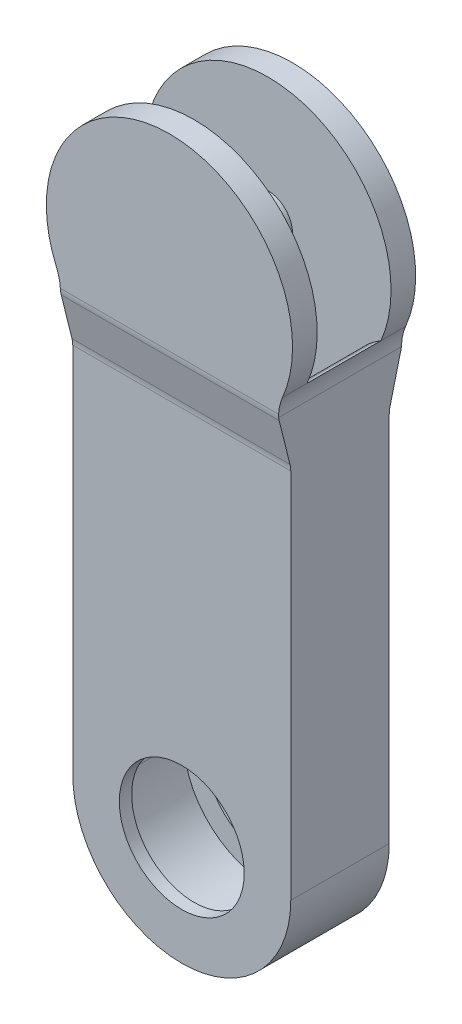
ISO-10303-21;
HEADER;
FILE_DESCRIPTION(('STEP AP214'),'2;1');
FILE_NAME('part.step','',(''),(''),'','','');
FILE_SCHEMA(('AUTOMOTIVE_DESIGN { 1 0 10303 214 1 1 1 1 }'));
ENDSEC;
DATA;
#1=APPLICATION_CONTEXT('core data for automotive mechanical design processes');
#2=APPLICATION_PROTOCOL_DEFINITION('international standard','automotive_design',2000,#1);
#3=PRODUCT_CONTEXT('',#1,'mechanical');
#4=PRODUCT('Part','Part','',(#3));
#5=PRODUCT_RELATED_PRODUCT_CATEGORY('part','',(#4));
#6=PRODUCT_DEFINITION_FORMATION('','',#4);
#7=PRODUCT_DEFINITION_CONTEXT('part definition',#1,'design');
#8=PRODUCT_DEFINITION('design','',#6,#7);
#9=PRODUCT_DEFINITION_SHAPE('','',#8);
#10=(LENGTH_UNIT() NAMED_UNIT(*) SI_UNIT(.MILLI.,.METRE.));
#11=(NAMED_UNIT(*) PLANE_ANGLE_UNIT() SI_UNIT($,.RADIAN.));
#12=(NAMED_UNIT(*) SI_UNIT($,.STERADIAN.) SOLID_ANGLE_UNIT());
#13=UNCERTAINTY_MEASURE_WITH_UNIT(LENGTH_MEASURE(1.E-05),#10,'distance_accuracy_value','');
#14=(GEOMETRIC_REPRESENTATION_CONTEXT(3) GLOBAL_UNCERTAINTY_ASSIGNED_CONTEXT((#13)) GLOBAL_UNIT_ASSIGNED_CONTEXT((#10,
#11,#12)) REPRESENTATION_CONTEXT('',''));
#15=CARTESIAN_POINT('',(0.,0.,0.));
#16=DIRECTION('',(0.,0.,1.));
#17=DIRECTION('',(1.,0.,0.));
#18=AXIS2_PLACEMENT_3D('',#15,#16,#17);
#19=CARTESIAN_POINT('',(0.,0.,25.));
#20=DIRECTION('',(0.,0.,-1.));
#21=DIRECTION('',(-1.,0.,0.));
#22=AXIS2_PLACEMENT_3D('',#19,#20,#21);
#23=CYLINDRICAL_SURFACE('',#22,50.);
#24=CARTESIAN_POINT('',(0.,0.,-15.));
#25=DIRECTION('',(0.,0.,1.));
#26=DIRECTION('',(1.,0.,0.));
#27=AXIS2_PLACEMENT_3D('',#24,#25,#26);
#28=CIRCLE('',#27,50.);
#29=CARTESIAN_POINT('',(45.9093584461448,-19.8073422513823,-15.));
#30=VERTEX_POINT('',#29);
#31=CARTESIAN_POINT('',(-45.9093584461448,-19.8073422513823,-15.));
#32=VERTEX_POINT('',#31);
#33=EDGE_CURVE('E399',#30,#32,#28,.T.);
#34=ORIENTED_EDGE('',*,*,#33,.F.);
#35=DIRECTION('',(0.,0.,-1.));
#36=VECTOR('',#35,1.);
#37=CARTESIAN_POINT('',(45.9093584461448,-19.8073422513823,25.));
#38=LINE('',#37,#36);
#39=CARTESIAN_POINT('',(45.9093584461448,-19.8073422513823,-25.));
#40=VERTEX_POINT('',#39);
#41=EDGE_CURVE('E334',#30,#40,#38,.T.);
#42=ORIENTED_EDGE('',*,*,#41,.T.);
#43=CARTESIAN_POINT('',(0.,0.,-25.));
#44=DIRECTION('',(0.,0.,1.));
#45=DIRECTION('',(1.,0.,0.));
#46=AXIS2_PLACEMENT_3D('',#43,#44,#45);
#47=CIRCLE('',#46,50.);
#48=CARTESIAN_POINT('',(-45.9093584461448,-19.8073422513823,-25.));
#49=VERTEX_POINT('',#48);
#50=EDGE_CURVE('E342',#40,#49,#47,.T.);
#51=ORIENTED_EDGE('',*,*,#50,.T.);
#52=DIRECTION('',(0.,0.,-1.));
#53=VECTOR('',#52,1.);
#54=CARTESIAN_POINT('',(-45.9093584461448,-19.8073422513823,25.));
#55=LINE('',#54,#53);
#56=EDGE_CURVE('E341',#32,#49,#55,.T.);
#57=ORIENTED_EDGE('',*,*,#56,.F.);
#58=EDGE_LOOP('',(#34,#42,#51,#57));
#59=FACE_BOUND('',#58,.T.);
#60=ADVANCED_FACE('F36',(#59),#23,.T.);
#61=CARTESIAN_POINT('',(-64.2731018246027,-27.7302791519353,25.));
#62=DIRECTION('',(0.,0.,-1.));
#63=DIRECTION('',(-1.,0.,0.));
#64=AXIS2_PLACEMENT_3D('',#61,#62,#63);
#65=CYLINDRICAL_SURFACE('',#64,20.);
#66=DIRECTION('',(0.,0.,-1.));
#67=VECTOR('',#66,1.);
#68=CARTESIAN_POINT('',(-44.2731018246027,-27.7302791519353,25.));
#69=LINE('',#68,#67);
#70=CARTESIAN_POINT('',(-44.2731018246027,-27.7302791519353,24.9239357360943));
#71=VERTEX_POINT('',#70);
#72=CARTESIAN_POINT('',(-44.2731018246027,-27.7302791519353,-24.9239357360943));
#73=VERTEX_POINT('',#72);
#74=EDGE_CURVE('E213',#71,#73,#69,.T.);
#75=ORIENTED_EDGE('',*,*,#74,.F.);
#76=CARTESIAN_POINT('',(-44.2731018246027,-27.7302791519353,24.9239357360943));
#77=CARTESIAN_POINT('',(-44.2730792391154,-27.5256910084496,24.9492904389356));
#78=CARTESIAN_POINT('',(-44.2762282332329,-27.3208089153584,24.9683064790151));
#79=CARTESIAN_POINT('',(-44.2888693806775,-26.9104568299662,24.9936612336503));
#80=CARTESIAN_POINT('',(-44.2983615340046,-26.7049868376652,24.999999948206));
#81=CARTESIAN_POINT('',(-44.3110252669364,-26.4992228957587,25.));
#82=B_SPLINE_CURVE_WITH_KNOTS('',3,(#76,#77,#78,#79,#80,#81),.UNSPECIFIED.,.F.,.F.,(4,2,4),(0.,
0.617360334102563,1.23472066820134),.UNSPECIFIED.);
#83=CARTESIAN_POINT('',(-44.3110252669364,-26.4992228957587,25.));
#84=VERTEX_POINT('',#83);
#85=EDGE_CURVE('E254',#71,#84,#82,.T.);
#86=ORIENTED_EDGE('',*,*,#85,.T.);
#87=CARTESIAN_POINT('',(-64.2731018246027,-27.7302791519353,25.));
#88=DIRECTION('',(0.,0.,-1.));
#89=DIRECTION('',(1.,0.,0.));
#90=AXIS2_PLACEMENT_3D('',#87,#88,#89);
#91=CIRCLE('',#90,20.);
#92=CARTESIAN_POINT('',(-45.9093584461448,-19.8073422513823,25.));
#93=VERTEX_POINT('',#92);
#94=EDGE_CURVE('E345',#93,#84,#91,.T.);
#95=ORIENTED_EDGE('',*,*,#94,.F.);
#96=CARTESIAN_POINT('',(-45.9093584461448,-19.8073422513823,15.));
#97=VERTEX_POINT('',#96);
#98=EDGE_CURVE('E338',#93,#97,#55,.T.);
#99=ORIENTED_EDGE('',*,*,#98,.T.);
#100=DIRECTION('',(0.,0.,1.));
#101=VECTOR('',#100,1.);
#102=CARTESIAN_POINT('',(-45.9093584461448,-19.8073422513823,-15.));
#103=LINE('',#102,#101);
#104=EDGE_CURVE('E370',#32,#97,#103,.T.);
#105=ORIENTED_EDGE('',*,*,#104,.F.);
#106=ORIENTED_EDGE('',*,*,#56,.T.);
#107=CARTESIAN_POINT('',(-64.2731018246027,-27.7302791519353,-25.));
#108=DIRECTION('',(0.,0.,-1.));
#109=DIRECTION('',(1.,0.,0.));
#110=AXIS2_PLACEMENT_3D('',#107,#108,#109);
#111=CIRCLE('',#110,20.);
#112=CARTESIAN_POINT('',(-44.3110252669364,-26.4992228957587,-25.));
#113=VERTEX_POINT('',#112);
#114=EDGE_CURVE('E348',#49,#113,#111,.T.);
#115=ORIENTED_EDGE('',*,*,#114,.T.);
#116=CARTESIAN_POINT('',(-44.3110252669364,-26.4992228957587,-25.));
#117=CARTESIAN_POINT('',(-44.2983615340046,-26.7049868376652,-24.999999948206));
#118=CARTESIAN_POINT('',(-44.2888693806775,-26.9104568299662,-24.9936612336503));
#119=CARTESIAN_POINT('',(-44.2762282332329,-27.3208089153584,-24.9683064790151));
#120=CARTESIAN_POINT('',(-44.2730792391154,-27.5256910084496,-24.9492904389356));
#121=CARTESIAN_POINT('',(-44.2731018246027,-27.7302791519353,-24.9239357360942));
#122=B_SPLINE_CURVE_WITH_KNOTS('',3,(#116,#117,#118,#119,#120,#121),.UNSPECIFIED.,.F.,.F.,(4,2,
4),(0.,0.61736033409878,1.23472066820135),.UNSPECIFIED.);
#123=EDGE_CURVE('E247',#113,#73,#122,.T.);
#124=ORIENTED_EDGE('',*,*,#123,.T.);
#125=EDGE_LOOP('',(#75,#86,#95,#99,#105,#106,#115,#124));
#126=FACE_BOUND('',#125,.T.);
#127=ADVANCED_FACE('F261',(#126),#65,.F.);
#128=CARTESIAN_POINT('',(-44.2731018246027,-200.,25.));
#129=DIRECTION('',(1.,0.,0.));
#130=DIRECTION('',(0.,0.,-1.));
#131=AXIS2_PLACEMENT_3D('',#128,#129,#130);
#132=PLANE('',#131);
#133=DIRECTION('',(0.,-0.970142500145332,-0.242535625036333));
#134=VECTOR('',#133,1.);
#135=CARTESIAN_POINT('',(-44.2731018246027,-27.7302791519353,25.));
#136=LINE('',#135,#134);
#137=CARTESIAN_POINT('',(-44.2731018246027,-28.924579146122,24.7014250014533));
#138=VERTEX_POINT('',#137);
#139=CARTESIAN_POINT('',(-44.2731018246027,-46.5359791577485,20.2985749985467));
#140=VERTEX_POINT('',#139);
#141=EDGE_CURVE('E197',#138,#140,#136,.T.);
#142=ORIENTED_EDGE('',*,*,#141,.F.);
#143=CARTESIAN_POINT('',(-44.2731018246027,-26.4992228957587,15.));
#144=DIRECTION('',(1.,0.,0.));
#145=DIRECTION('',(0.,0.,-1.));
#146=AXIS2_PLACEMENT_3D('',#143,#144,#145);
#147=CIRCLE('',#146,10.);
#148=EDGE_CURVE('E245',#138,#71,#147,.F.);
#149=ORIENTED_EDGE('',*,*,#148,.T.);
#150=ORIENTED_EDGE('',*,*,#74,.T.);
#151=CARTESIAN_POINT('',(-44.2731018246027,-26.4992228957587,-15.));
#152=DIRECTION('',(1.,0.,0.));
#153=DIRECTION('',(0.,0.,-1.));
#154=AXIS2_PLACEMENT_3D('',#151,#152,#153);
#155=CIRCLE('',#154,10.);
#156=CARTESIAN_POINT('',(-44.2731018246027,-28.924579146122,-24.7014250014533));
#157=VERTEX_POINT('',#156);
#158=EDGE_CURVE('E243',#73,#157,#155,.F.);
#159=ORIENTED_EDGE('',*,*,#158,.T.);
#160=DIRECTION('',(0.,0.970142500145332,-0.242535625036333));
#161=VECTOR('',#160,1.);
#162=CARTESIAN_POINT('',(-44.2731018246027,-27.7302791519353,-25.));
#163=LINE('',#162,#161);
#164=CARTESIAN_POINT('',(-44.2731018246027,-46.5359791577485,-20.2985749985467));
#165=VERTEX_POINT('',#164);
#166=EDGE_CURVE('E233',#165,#157,#163,.T.);
#167=ORIENTED_EDGE('',*,*,#166,.F.);
#168=CARTESIAN_POINT('',(-44.2731018246027,-48.9613354081119,-30.));
#169=DIRECTION('',(1.,0.,0.));
#170=DIRECTION('',(0.,0.,-1.));
#171=AXIS2_PLACEMENT_3D('',#168,#169,#170);
#172=CIRCLE('',#171,10.);
#173=CARTESIAN_POINT('',(-44.2731018246027,-48.9613354081119,-20.));
#174=VERTEX_POINT('',#173);
#175=EDGE_CURVE('E45',#165,#174,#172,.T.);
#176=ORIENTED_EDGE('',*,*,#175,.T.);
#177=DIRECTION('',(0.,1.,0.));
#178=VECTOR('',#177,1.);
#179=CARTESIAN_POINT('',(-44.2731018246027,-47.7302791519353,-20.));
#180=LINE('',#179,#178);
#181=CARTESIAN_POINT('',(-44.2731018246027,-200.,-20.));
#182=VERTEX_POINT('',#181);
#183=EDGE_CURVE('E212',#182,#174,#180,.T.);
#184=ORIENTED_EDGE('',*,*,#183,.F.);
#185=DIRECTION('',(0.,0.,-1.));
#186=VECTOR('',#185,1.);
#187=CARTESIAN_POINT('',(-44.2731018246027,-200.,25.));
#188=LINE('',#187,#186);
#189=CARTESIAN_POINT('',(-44.2731018246027,-200.,20.));
#190=VERTEX_POINT('',#189);
#191=EDGE_CURVE('E202',#190,#182,#188,.T.);
#192=ORIENTED_EDGE('',*,*,#191,.F.);
#193=DIRECTION('',(0.,-1.,0.));
#194=VECTOR('',#193,1.);
#195=CARTESIAN_POINT('',(-44.2731018246027,-47.7302791519353,20.));
#196=LINE('',#195,#194);
#197=CARTESIAN_POINT('',(-44.2731018246027,-48.9613354081119,20.));
#198=VERTEX_POINT('',#197);
#199=EDGE_CURVE('E187',#198,#190,#196,.T.);
#200=ORIENTED_EDGE('',*,*,#199,.F.);
#201=CARTESIAN_POINT('',(-44.2731018246027,-48.9613354081119,30.));
#202=DIRECTION('',(1.,0.,0.));
#203=DIRECTION('',(0.,0.,-1.));
#204=AXIS2_PLACEMENT_3D('',#201,#202,#203);
#205=CIRCLE('',#204,10.);
#206=EDGE_CURVE('E439',#198,#140,#205,.T.);
#207=ORIENTED_EDGE('',*,*,#206,.T.);
#208=EDGE_LOOP('',(#142,#149,#150,#159,#167,#176,#184,#192,#200,#207));
#209=FACE_BOUND('',#208,.T.);
#210=ADVANCED_FACE('F210',(#209),#132,.F.);
#211=CARTESIAN_POINT('',(0.,-200.,25.));
#212=DIRECTION('',(0.,0.,-1.));
#213=DIRECTION('',(-1.,0.,0.));
#214=AXIS2_PLACEMENT_3D('',#211,#212,#213);
#215=CYLINDRICAL_SURFACE('',#214,44.2731018246027);
#216=DIRECTION('',(0.,0.,-1.));
#217=VECTOR('',#216,1.);
#218=CARTESIAN_POINT('',(44.2731018246027,-200.,25.));
#219=LINE('',#218,#217);
#220=CARTESIAN_POINT('',(44.2731018246027,-200.,20.));
#221=VERTEX_POINT('',#220);
#222=CARTESIAN_POINT('',(44.2731018246027,-200.,-20.));
#223=VERTEX_POINT('',#222);
#224=EDGE_CURVE('E204',#221,#223,#219,.T.);
#225=ORIENTED_EDGE('',*,*,#224,.F.);
#226=CARTESIAN_POINT('',(0.,-200.,20.));
#227=DIRECTION('',(0.,0.,-1.));
#228=DIRECTION('',(-1.,0.,0.));
#229=AXIS2_PLACEMENT_3D('',#226,#227,#228);
#230=CIRCLE('',#229,44.2731018246027);
#231=EDGE_CURVE('E191',#221,#190,#230,.T.);
#232=ORIENTED_EDGE('',*,*,#231,.T.);
#233=ORIENTED_EDGE('',*,*,#191,.T.);
#234=CARTESIAN_POINT('',(0.,-200.,-20.));
#235=DIRECTION('',(0.,0.,1.));
#236=DIRECTION('',(1.,0.,0.));
#237=AXIS2_PLACEMENT_3D('',#234,#235,#236);
#238=CIRCLE('',#237,44.2731018246027);
#239=EDGE_CURVE('E424',#182,#223,#238,.T.);
#240=ORIENTED_EDGE('',*,*,#239,.T.);
#241=EDGE_LOOP('',(#225,#232,#233,#240));
#242=FACE_BOUND('',#241,.T.);
#243=ADVANCED_FACE('F200',(#242),#215,.T.);
#244=CARTESIAN_POINT('',(44.2731018246027,-200.,25.));
#245=DIRECTION('',(-1.,0.,0.));
#246=DIRECTION('',(0.,0.,1.));
#247=AXIS2_PLACEMENT_3D('',#244,#245,#246);
#248=PLANE('',#247);
#249=DIRECTION('',(0.,0.,-1.));
#250=VECTOR('',#249,1.);
#251=CARTESIAN_POINT('',(44.2731018246027,-27.7302791519352,25.));
#252=LINE('',#251,#250);
#253=CARTESIAN_POINT('',(44.2731018246027,-27.7302791519352,24.9239357360943));
#254=VERTEX_POINT('',#253);
#255=CARTESIAN_POINT('',(44.2731018246027,-27.7302791519352,-24.9239357360943));
#256=VERTEX_POINT('',#255);
#257=EDGE_CURVE('E218',#254,#256,#252,.T.);
#258=ORIENTED_EDGE('',*,*,#257,.F.);
#259=CARTESIAN_POINT('',(44.2731018246027,-26.4992228957587,15.));
#260=DIRECTION('',(-1.,0.,0.));
#261=DIRECTION('',(0.,0.,1.));
#262=AXIS2_PLACEMENT_3D('',#259,#260,#261);
#263=CIRCLE('',#262,10.);
#264=CARTESIAN_POINT('',(44.2731018246027,-28.9245791461219,24.7014250014533));
#265=VERTEX_POINT('',#264);
#266=EDGE_CURVE('E452',#254,#265,#263,.F.);
#267=ORIENTED_EDGE('',*,*,#266,.T.);
#268=DIRECTION('',(0.,-0.970142500145332,-0.242535625036333));
#269=VECTOR('',#268,1.);
#270=CARTESIAN_POINT('',(44.2731018246027,-189.866487008937,-15.5340519642505));
#271=LINE('',#270,#269);
#272=CARTESIAN_POINT('',(44.2731018246027,-46.5359791577485,20.2985749985467));
#273=VERTEX_POINT('',#272);
#274=EDGE_CURVE('E205',#265,#273,#271,.T.);
#275=ORIENTED_EDGE('',*,*,#274,.T.);
#276=CARTESIAN_POINT('',(44.2731018246027,-48.9613354081119,30.));
#277=DIRECTION('',(-1.,0.,0.));
#278=DIRECTION('',(0.,0.,1.));
#279=AXIS2_PLACEMENT_3D('',#276,#277,#278);
#280=CIRCLE('',#279,10.);
#281=CARTESIAN_POINT('',(44.2731018246027,-48.9613354081119,20.));
#282=VERTEX_POINT('',#281);
#283=EDGE_CURVE('E440',#273,#282,#280,.T.);
#284=ORIENTED_EDGE('',*,*,#283,.T.);
#285=DIRECTION('',(0.,-1.,0.));
#286=VECTOR('',#285,1.);
#287=CARTESIAN_POINT('',(44.2731018246027,-200.,20.));
#288=LINE('',#287,#286);
#289=EDGE_CURVE('E206',#282,#221,#288,.T.);
#290=ORIENTED_EDGE('',*,*,#289,.T.);
#291=ORIENTED_EDGE('',*,*,#224,.T.);
#292=DIRECTION('',(0.,1.,0.));
#293=VECTOR('',#292,1.);
#294=CARTESIAN_POINT('',(44.2731018246027,-200.,-20.));
#295=LINE('',#294,#293);
#296=CARTESIAN_POINT('',(44.2731018246027,-48.9613354081119,-20.));
#297=VERTEX_POINT('',#296);
#298=EDGE_CURVE('E232',#223,#297,#295,.T.);
#299=ORIENTED_EDGE('',*,*,#298,.T.);
#300=CARTESIAN_POINT('',(44.2731018246027,-48.9613354081119,-30.));
#301=DIRECTION('',(-1.,0.,0.));
#302=DIRECTION('',(0.,0.,1.));
#303=AXIS2_PLACEMENT_3D('',#300,#301,#302);
#304=CIRCLE('',#303,10.);
#305=CARTESIAN_POINT('',(44.2731018246027,-46.5359791577485,-20.2985749985467));
#306=VERTEX_POINT('',#305);
#307=EDGE_CURVE('E11',#297,#306,#304,.T.);
#308=ORIENTED_EDGE('',*,*,#307,.T.);
#309=DIRECTION('',(0.,0.970142500145332,-0.242535625036333));
#310=VECTOR('',#309,1.);
#311=CARTESIAN_POINT('',(44.2731018246027,-201.63119289129,18.4752284348388));
#312=LINE('',#311,#310);
#313=CARTESIAN_POINT('',(44.2731018246027,-28.924579146122,-24.7014250014533));
#314=VERTEX_POINT('',#313);
#315=EDGE_CURVE('E422',#306,#314,#312,.T.);
#316=ORIENTED_EDGE('',*,*,#315,.T.);
#317=CARTESIAN_POINT('',(44.2731018246027,-26.4992228957587,-15.));
#318=DIRECTION('',(-1.,0.,0.));
#319=DIRECTION('',(0.,0.,1.));
#320=AXIS2_PLACEMENT_3D('',#317,#318,#319);
#321=CIRCLE('',#320,10.);
#322=EDGE_CURVE('E287',#314,#256,#321,.F.);
#323=ORIENTED_EDGE('',*,*,#322,.T.);
#324=EDGE_LOOP('',(#258,#267,#275,#284,#290,#291,#299,#308,#316,#323));
#325=FACE_BOUND('',#324,.T.);
#326=ADVANCED_FACE('F300',(#325),#248,.F.);
#327=CARTESIAN_POINT('',(64.2731018246027,-27.7302791519352,25.));
#328=DIRECTION('',(0.,0.,-1.));
#329=DIRECTION('',(-1.,0.,0.));
#330=AXIS2_PLACEMENT_3D('',#327,#328,#329);
#331=CYLINDRICAL_SURFACE('',#330,20.);
#332=CARTESIAN_POINT('',(64.2731018246027,-27.7302791519352,25.));
#333=DIRECTION('',(0.,0.,-1.));
#334=DIRECTION('',(-1.,0.,0.));
#335=AXIS2_PLACEMENT_3D('',#332,#333,#334);
#336=CIRCLE('',#335,20.);
#337=CARTESIAN_POINT('',(44.3110252669365,-26.4992228957587,25.));
#338=VERTEX_POINT('',#337);
#339=CARTESIAN_POINT('',(45.9093584461448,-19.8073422513823,25.));
#340=VERTEX_POINT('',#339);
#341=EDGE_CURVE('E353',#338,#340,#336,.T.);
#342=ORIENTED_EDGE('',*,*,#341,.F.);
#343=CARTESIAN_POINT('',(44.3110252669365,-26.4992228957587,25.));
#344=CARTESIAN_POINT('',(44.2983615340046,-26.7049868376651,24.999999948206));
#345=CARTESIAN_POINT('',(44.2888693806775,-26.9104568299661,24.9936612336503));
#346=CARTESIAN_POINT('',(44.2762282332329,-27.3208089153583,24.9683064790151));
#347=CARTESIAN_POINT('',(44.2730792391154,-27.5256910084495,24.9492904389356));
#348=CARTESIAN_POINT('',(44.2731018246027,-27.7302791519352,24.9239357360943));
#349=B_SPLINE_CURVE_WITH_KNOTS('',3,(#343,#344,#345,#346,#347,#348),.UNSPECIFIED.,.F.,.F.,(4,2,
4),(0.,0.617360334098735,1.23472066820126),.UNSPECIFIED.);
#350=EDGE_CURVE('E279',#338,#254,#349,.T.);
#351=ORIENTED_EDGE('',*,*,#350,.T.);
#352=ORIENTED_EDGE('',*,*,#257,.T.);
#353=CARTESIAN_POINT('',(44.2731018246027,-27.7302791519352,-24.9239357360943));
#354=CARTESIAN_POINT('',(44.2730792391154,-27.5256910084495,-24.9492904389356));
#355=CARTESIAN_POINT('',(44.2762282332329,-27.3208089153583,-24.9683064790151));
#356=CARTESIAN_POINT('',(44.2888693806775,-26.9104568299661,-24.9936612336503));
#357=CARTESIAN_POINT('',(44.2983615340046,-26.7049868376651,-24.999999948206));
#358=CARTESIAN_POINT('',(44.3110252669365,-26.4992228957587,-25.));
#359=B_SPLINE_CURVE_WITH_KNOTS('',3,(#353,#354,#355,#356,#357,#358),.UNSPECIFIED.,.F.,.F.,(4,2,
4),(0.,0.617360334102525,1.23472066820126),.UNSPECIFIED.);
#360=CARTESIAN_POINT('',(44.3110252669365,-26.4992228957587,-25.));
#361=VERTEX_POINT('',#360);
#362=EDGE_CURVE('E288',#256,#361,#359,.T.);
#363=ORIENTED_EDGE('',*,*,#362,.T.);
#364=CARTESIAN_POINT('',(64.2731018246027,-27.7302791519352,-25.));
#365=DIRECTION('',(0.,0.,-1.));
#366=DIRECTION('',(-1.,0.,0.));
#367=AXIS2_PLACEMENT_3D('',#364,#365,#366);
#368=CIRCLE('',#367,20.);
#369=EDGE_CURVE('E346',#361,#40,#368,.T.);
#370=ORIENTED_EDGE('',*,*,#369,.T.);
#371=ORIENTED_EDGE('',*,*,#41,.F.);
#372=DIRECTION('',(0.,0.,1.));
#373=VECTOR('',#372,1.);
#374=CARTESIAN_POINT('',(45.9093584461448,-19.8073422513823,-15.));
#375=LINE('',#374,#373);
#376=CARTESIAN_POINT('',(45.9093584461448,-19.8073422513823,15.));
#377=VERTEX_POINT('',#376);
#378=EDGE_CURVE('E368',#30,#377,#375,.T.);
#379=ORIENTED_EDGE('',*,*,#378,.T.);
#380=EDGE_CURVE('E327',#340,#377,#38,.T.);
#381=ORIENTED_EDGE('',*,*,#380,.F.);
#382=EDGE_LOOP('',(#342,#351,#352,#363,#370,#371,#379,#381));
#383=FACE_BOUND('',#382,.T.);
#384=ADVANCED_FACE('F294',(#383),#331,.F.);
#385=ORIENTED_EDGE('',*,*,#380,.T.);
#386=CARTESIAN_POINT('',(0.,0.,15.));
#387=DIRECTION('',(0.,0.,1.));
#388=DIRECTION('',(1.,0.,0.));
#389=AXIS2_PLACEMENT_3D('',#386,#387,#388);
#390=CIRCLE('',#389,50.);
#391=EDGE_CURVE('E329',#377,#97,#390,.T.);
#392=ORIENTED_EDGE('',*,*,#391,.T.);
#393=ORIENTED_EDGE('',*,*,#98,.F.);
#394=CARTESIAN_POINT('',(0.,0.,25.));
#395=DIRECTION('',(0.,0.,1.));
#396=DIRECTION('',(1.,0.,0.));
#397=AXIS2_PLACEMENT_3D('',#394,#395,#396);
#398=CIRCLE('',#397,50.);
#399=EDGE_CURVE('E331',#340,#93,#398,.T.);
#400=ORIENTED_EDGE('',*,*,#399,.F.);
#401=EDGE_LOOP('',(#385,#392,#393,#400));
#402=FACE_BOUND('',#401,.T.);
#403=ADVANCED_FACE('F299',(#402),#23,.T.);
#404=CARTESIAN_POINT('',(-64.2731018246027,-27.7302791519353,25.));
#405=DIRECTION('',(0.,0.,1.));
#406=DIRECTION('',(1.,0.,0.));
#407=AXIS2_PLACEMENT_3D('',#404,#405,#406);
#408=PLANE('',#407);
#409=ORIENTED_EDGE('',*,*,#94,.T.);
#410=DIRECTION('',(-1.,0.,0.));
#411=VECTOR('',#410,1.);
#412=CARTESIAN_POINT('',(44.2731018246027,-26.4992228957587,25.));
#413=LINE('',#412,#411);
#414=EDGE_CURVE('E461',#84,#338,#413,.F.);
#415=ORIENTED_EDGE('',*,*,#414,.T.);
#416=ORIENTED_EDGE('',*,*,#341,.T.);
#417=ORIENTED_EDGE('',*,*,#399,.T.);
#418=EDGE_LOOP('',(#409,#415,#416,#417));
#419=FACE_BOUND('',#418,.T.);
#420=ADVANCED_FACE('F315',(#419),#408,.T.);
#421=CARTESIAN_POINT('',(-64.2731018246027,-27.7302791519353,-25.));
#422=DIRECTION('',(0.,0.,1.));
#423=DIRECTION('',(1.,0.,0.));
#424=AXIS2_PLACEMENT_3D('',#421,#422,#423);
#425=PLANE('',#424);
#426=ORIENTED_EDGE('',*,*,#369,.F.);
#427=DIRECTION('',(-1.,0.,0.));
#428=VECTOR('',#427,1.);
#429=CARTESIAN_POINT('',(-64.2731018246027,-26.4992228957587,-25.));
#430=LINE('',#429,#428);
#431=EDGE_CURVE('E442',#361,#113,#430,.T.);
#432=ORIENTED_EDGE('',*,*,#431,.T.);
#433=ORIENTED_EDGE('',*,*,#114,.F.);
#434=ORIENTED_EDGE('',*,*,#50,.F.);
#435=EDGE_LOOP('',(#426,#432,#433,#434));
#436=FACE_BOUND('',#435,.T.);
#437=ADVANCED_FACE('F320',(#436),#425,.F.);
#438=CARTESIAN_POINT('',(-54.2731018246027,-38.3084945881365,-15.));
#439=DIRECTION('',(0.,0.,1.));
#440=DIRECTION('',(1.,0.,0.));
#441=AXIS2_PLACEMENT_3D('',#438,#439,#440);
#442=CYLINDRICAL_SURFACE('',#441,20.);
#443=CARTESIAN_POINT('',(-54.2731018246027,-38.3084945881365,15.));
#444=DIRECTION('',(0.,0.,-1.));
#445=DIRECTION('',(1.,0.,0.));
#446=AXIS2_PLACEMENT_3D('',#443,#444,#445);
#447=CIRCLE('',#446,20.);
#448=CARTESIAN_POINT('',(-43.0169141869881,-21.7767602608854,15.));
#449=VERTEX_POINT('',#448);
#450=CARTESIAN_POINT('',(-34.2731018246027,-38.3084945881366,15.));
#451=VERTEX_POINT('',#450);
#452=EDGE_CURVE('E394',#449,#451,#447,.T.);
#453=ORIENTED_EDGE('',*,*,#452,.T.);
#454=DIRECTION('',(0.,0.,1.));
#455=VECTOR('',#454,1.);
#456=CARTESIAN_POINT('',(-34.2731018246027,-38.3084945881366,-15.));
#457=LINE('',#456,#455);
#458=CARTESIAN_POINT('',(-34.2731018246027,-38.3084945881366,-15.));
#459=VERTEX_POINT('',#458);
#460=EDGE_CURVE('E357',#459,#451,#457,.T.);
#461=ORIENTED_EDGE('',*,*,#460,.F.);
#462=CARTESIAN_POINT('',(-54.2731018246027,-38.3084945881365,-15.));
#463=DIRECTION('',(0.,0.,-1.));
#464=DIRECTION('',(1.,0.,0.));
#465=AXIS2_PLACEMENT_3D('',#462,#463,#464);
#466=CIRCLE('',#465,20.);
#467=CARTESIAN_POINT('',(-43.0169141869881,-21.7767602608854,-15.));
#468=VERTEX_POINT('',#467);
#469=EDGE_CURVE('E377',#468,#459,#466,.T.);
#470=ORIENTED_EDGE('',*,*,#469,.F.);
#471=DIRECTION('',(0.,0.,1.));
#472=VECTOR('',#471,1.);
#473=CARTESIAN_POINT('',(-43.0169141869881,-21.7767602608854,-15.));
#474=LINE('',#473,#472);
#475=EDGE_CURVE('E351',#468,#449,#474,.T.);
#476=ORIENTED_EDGE('',*,*,#475,.T.);
#477=EDGE_LOOP('',(#453,#461,#470,#476));
#478=FACE_BOUND('',#477,.T.);
#479=ADVANCED_FACE('F496',(#478),#442,.T.);
#480=CARTESIAN_POINT('',(-43.0169141869881,-21.7767602608854,-15.));
#481=DIRECTION('',(-0.562809381880735,-0.826586716362551,0.));
#482=DIRECTION('',(0.826586716362551,-0.562809381880735,0.));
#483=AXIS2_PLACEMENT_3D('',#480,#481,#482);
#484=PLANE('',#483);
#485=DIRECTION('',(0.826586716362551,-0.562809381880735,0.));
#486=VECTOR('',#485,1.);
#487=CARTESIAN_POINT('',(-43.0169141869881,-21.7767602608854,15.));
#488=LINE('',#487,#486);
#489=EDGE_CURVE('E374',#97,#449,#488,.T.);
#490=ORIENTED_EDGE('',*,*,#489,.T.);
#491=ORIENTED_EDGE('',*,*,#475,.F.);
#492=DIRECTION('',(0.826586716362551,-0.562809381880735,0.));
#493=VECTOR('',#492,1.);
#494=CARTESIAN_POINT('',(-43.0169141869881,-21.7767602608854,-15.));
#495=LINE('',#494,#493);
#496=EDGE_CURVE('E360',#32,#468,#495,.T.);
#497=ORIENTED_EDGE('',*,*,#496,.F.);
#498=ORIENTED_EDGE('',*,*,#104,.T.);
#499=EDGE_LOOP('',(#490,#491,#497,#498));
#500=FACE_BOUND('',#499,.T.);
#501=ADVANCED_FACE('F492',(#500),#484,.F.);
#502=CARTESIAN_POINT('',(45.9093584461448,-19.8073422513823,-15.));
#503=DIRECTION('',(0.562809381880735,-0.826586716362551,0.));
#504=DIRECTION('',(0.826586716362551,0.562809381880736,0.));
#505=AXIS2_PLACEMENT_3D('',#502,#503,#504);
#506=PLANE('',#505);
#507=DIRECTION('',(0.826586716362551,0.562809381880736,0.));
#508=VECTOR('',#507,1.);
#509=CARTESIAN_POINT('',(45.9093584461448,-19.8073422513823,15.));
#510=LINE('',#509,#508);
#511=CARTESIAN_POINT('',(43.0169141869881,-21.7767602608854,15.));
#512=VERTEX_POINT('',#511);
#513=EDGE_CURVE('E379',#512,#377,#510,.T.);
#514=ORIENTED_EDGE('',*,*,#513,.T.);
#515=ORIENTED_EDGE('',*,*,#378,.F.);
#516=DIRECTION('',(0.826586716362551,0.562809381880736,0.));
#517=VECTOR('',#516,1.);
#518=CARTESIAN_POINT('',(45.9093584461448,-19.8073422513823,-15.));
#519=LINE('',#518,#517);
#520=CARTESIAN_POINT('',(43.0169141869881,-21.7767602608854,-15.));
#521=VERTEX_POINT('',#520);
#522=EDGE_CURVE('E401',#521,#30,#519,.T.);
#523=ORIENTED_EDGE('',*,*,#522,.F.);
#524=DIRECTION('',(0.,0.,1.));
#525=VECTOR('',#524,1.);
#526=CARTESIAN_POINT('',(43.0169141869881,-21.7767602608854,-15.));
#527=LINE('',#526,#525);
#528=EDGE_CURVE('E366',#521,#512,#527,.T.);
#529=ORIENTED_EDGE('',*,*,#528,.T.);
#530=EDGE_LOOP('',(#514,#515,#523,#529));
#531=FACE_BOUND('',#530,.T.);
#532=ADVANCED_FACE('F476',(#531),#506,.F.);
#533=CARTESIAN_POINT('',(54.2731018246027,-38.3084945881365,-15.));
#534=DIRECTION('',(0.,0.,1.));
#535=DIRECTION('',(1.,0.,0.));
#536=AXIS2_PLACEMENT_3D('',#533,#534,#535);
#537=CYLINDRICAL_SURFACE('',#536,20.);
#538=CARTESIAN_POINT('',(54.2731018246027,-38.3084945881365,15.));
#539=DIRECTION('',(0.,0.,-1.));
#540=DIRECTION('',(-1.,0.,0.));
#541=AXIS2_PLACEMENT_3D('',#538,#539,#540);
#542=CIRCLE('',#541,20.);
#543=CARTESIAN_POINT('',(34.2731018246027,-38.3084945881366,15.));
#544=VERTEX_POINT('',#543);
#545=EDGE_CURVE('E382',#544,#512,#542,.T.);
#546=ORIENTED_EDGE('',*,*,#545,.T.);
#547=ORIENTED_EDGE('',*,*,#528,.F.);
#548=CARTESIAN_POINT('',(54.2731018246027,-38.3084945881365,-15.));
#549=DIRECTION('',(0.,0.,-1.));
#550=DIRECTION('',(-1.,0.,0.));
#551=AXIS2_PLACEMENT_3D('',#548,#549,#550);
#552=CIRCLE('',#551,20.);
#553=CARTESIAN_POINT('',(34.2731018246027,-38.3084945881366,-15.));
#554=VERTEX_POINT('',#553);
#555=EDGE_CURVE('E404',#554,#521,#552,.T.);
#556=ORIENTED_EDGE('',*,*,#555,.F.);
#557=DIRECTION('',(0.,0.,1.));
#558=VECTOR('',#557,1.);
#559=CARTESIAN_POINT('',(34.2731018246027,-38.3084945881366,-15.));
#560=LINE('',#559,#558);
#561=EDGE_CURVE('E364',#554,#544,#560,.T.);
#562=ORIENTED_EDGE('',*,*,#561,.T.);
#563=EDGE_LOOP('',(#546,#547,#556,#562));
#564=FACE_BOUND('',#563,.T.);
#565=ADVANCED_FACE('F484',(#564),#537,.T.);
#566=CARTESIAN_POINT('',(34.2731018246027,-200.,-15.));
#567=DIRECTION('',(1.,0.,0.));
#568=DIRECTION('',(0.,0.,-1.));
#569=AXIS2_PLACEMENT_3D('',#566,#567,#568);
#570=PLANE('',#569);
#571=DIRECTION('',(0.,1.,0.));
#572=VECTOR('',#571,1.);
#573=CARTESIAN_POINT('',(34.2731018246027,-200.,15.));
#574=LINE('',#573,#572);
#575=CARTESIAN_POINT('',(34.2731018246027,-200.,15.));
#576=VERTEX_POINT('',#575);
#577=EDGE_CURVE('E385',#576,#544,#574,.T.);
#578=ORIENTED_EDGE('',*,*,#577,.T.);
#579=ORIENTED_EDGE('',*,*,#561,.F.);
#580=DIRECTION('',(0.,1.,0.));
#581=VECTOR('',#580,1.);
#582=CARTESIAN_POINT('',(34.2731018246027,-200.,-15.));
#583=LINE('',#582,#581);
#584=CARTESIAN_POINT('',(34.2731018246027,-200.,-15.));
#585=VERTEX_POINT('',#584);
#586=EDGE_CURVE('E407',#585,#554,#583,.T.);
#587=ORIENTED_EDGE('',*,*,#586,.F.);
#588=DIRECTION('',(0.,0.,1.));
#589=VECTOR('',#588,1.);
#590=CARTESIAN_POINT('',(34.2731018246027,-200.,-15.));
#591=LINE('',#590,#589);
#592=EDGE_CURVE('E362',#585,#576,#591,.T.);
#593=ORIENTED_EDGE('',*,*,#592,.T.);
#594=EDGE_LOOP('',(#578,#579,#587,#593));
#595=FACE_BOUND('',#594,.T.);
#596=ADVANCED_FACE('F504',(#595),#570,.F.);
#597=CARTESIAN_POINT('',(0.,-200.,-15.));
#598=DIRECTION('',(0.,0.,1.));
#599=DIRECTION('',(1.,0.,0.));
#600=AXIS2_PLACEMENT_3D('',#597,#598,#599);
#601=CYLINDRICAL_SURFACE('',#600,34.2731018246027);
#602=CARTESIAN_POINT('',(0.,-200.,15.));
#603=DIRECTION('',(0.,0.,1.));
#604=DIRECTION('',(-1.,0.,0.));
#605=AXIS2_PLACEMENT_3D('',#602,#603,#604);
#606=CIRCLE('',#605,34.2731018246027);
#607=CARTESIAN_POINT('',(-34.2731018246027,-200.,15.));
#608=VERTEX_POINT('',#607);
#609=EDGE_CURVE('E388',#608,#576,#606,.T.);
#610=ORIENTED_EDGE('',*,*,#609,.T.);
#611=ORIENTED_EDGE('',*,*,#592,.F.);
#612=CARTESIAN_POINT('',(0.,-200.,-15.));
#613=DIRECTION('',(0.,0.,1.));
#614=DIRECTION('',(-1.,0.,0.));
#615=AXIS2_PLACEMENT_3D('',#612,#613,#614);
#616=CIRCLE('',#615,34.2731018246027);
#617=CARTESIAN_POINT('',(-34.2731018246027,-200.,-15.));
#618=VERTEX_POINT('',#617);
#619=EDGE_CURVE('E410',#618,#585,#616,.T.);
#620=ORIENTED_EDGE('',*,*,#619,.F.);
#621=DIRECTION('',(0.,0.,1.));
#622=VECTOR('',#621,1.);
#623=CARTESIAN_POINT('',(-34.2731018246027,-200.,-15.));
#624=LINE('',#623,#622);
#625=EDGE_CURVE('E359',#618,#608,#624,.T.);
#626=ORIENTED_EDGE('',*,*,#625,.T.);
#627=EDGE_LOOP('',(#610,#611,#620,#626));
#628=FACE_BOUND('',#627,.T.);
#629=ADVANCED_FACE('F502',(#628),#601,.F.);
#630=CARTESIAN_POINT('',(-34.2731018246027,-38.3084945881366,-15.));
#631=DIRECTION('',(-1.,0.,0.));
#632=DIRECTION('',(0.,0.,1.));
#633=AXIS2_PLACEMENT_3D('',#630,#631,#632);
#634=PLANE('',#633);
#635=DIRECTION('',(0.,-1.,0.));
#636=VECTOR('',#635,1.);
#637=CARTESIAN_POINT('',(-34.2731018246027,-38.3084945881366,15.));
#638=LINE('',#637,#636);
#639=EDGE_CURVE('E391',#451,#608,#638,.T.);
#640=ORIENTED_EDGE('',*,*,#639,.T.);
#641=ORIENTED_EDGE('',*,*,#625,.F.);
#642=DIRECTION('',(0.,-1.,0.));
#643=VECTOR('',#642,1.);
#644=CARTESIAN_POINT('',(-34.2731018246027,-38.3084945881366,-15.));
#645=LINE('',#644,#643);
#646=EDGE_CURVE('E413',#459,#618,#645,.T.);
#647=ORIENTED_EDGE('',*,*,#646,.F.);
#648=ORIENTED_EDGE('',*,*,#460,.T.);
#649=EDGE_LOOP('',(#640,#641,#647,#648));
#650=FACE_BOUND('',#649,.T.);
#651=ADVANCED_FACE('F498',(#650),#634,.F.);
#652=CARTESIAN_POINT('',(-54.2731018246027,-38.3084945881365,-15.));
#653=DIRECTION('',(0.,0.,1.));
#654=DIRECTION('',(1.,0.,0.));
#655=AXIS2_PLACEMENT_3D('',#652,#653,#654);
#656=PLANE('',#655);
#657=CARTESIAN_POINT('',(0.,0.,-15.));
#658=DIRECTION('',(0.,0.,1.));
#659=DIRECTION('',(1.,0.,0.));
#660=AXIS2_PLACEMENT_3D('',#657,#658,#659);
#661=CIRCLE('',#660,10.);
#662=CARTESIAN_POINT('',(-10.,0.,-15.));
#663=VERTEX_POINT('',#662);
#664=EDGE_CURVE('E226',#663,#663,#661,.T.);
#665=ORIENTED_EDGE('',*,*,#664,.F.);
#666=EDGE_LOOP('',(#665));
#667=FACE_BOUND('',#666,.T.);
#668=CARTESIAN_POINT('',(0.,-200.,-15.));
#669=DIRECTION('',(0.,0.,1.));
#670=DIRECTION('',(1.,0.,0.));
#671=AXIS2_PLACEMENT_3D('',#668,#669,#670);
#672=CIRCLE('',#671,25.355);
#673=CARTESIAN_POINT('',(25.355,-200.,-15.));
#674=VERTEX_POINT('',#673);
#675=EDGE_CURVE('E225',#674,#674,#672,.T.);
#676=ORIENTED_EDGE('',*,*,#675,.F.);
#677=EDGE_LOOP('',(#676));
#678=FACE_BOUND('',#677,.T.);
#679=ORIENTED_EDGE('',*,*,#469,.T.);
#680=ORIENTED_EDGE('',*,*,#646,.T.);
#681=ORIENTED_EDGE('',*,*,#619,.T.);
#682=ORIENTED_EDGE('',*,*,#586,.T.);
#683=ORIENTED_EDGE('',*,*,#555,.T.);
#684=ORIENTED_EDGE('',*,*,#522,.T.);
#685=ORIENTED_EDGE('',*,*,#33,.T.);
#686=ORIENTED_EDGE('',*,*,#496,.T.);
#687=EDGE_LOOP('',(#679,#680,#681,#682,#683,#684,#685,#686));
#688=FACE_BOUND('',#687,.T.);
#689=ADVANCED_FACE('F479',(#667,#678,#688),#656,.T.);
#690=CARTESIAN_POINT('',(-54.2731018246027,-38.3084945881365,15.));
#691=DIRECTION('',(0.,0.,1.));
#692=DIRECTION('',(1.,0.,0.));
#693=AXIS2_PLACEMENT_3D('',#690,#691,#692);
#694=PLANE('',#693);
#695=CARTESIAN_POINT('',(0.,0.,15.));
#696=DIRECTION('',(0.,0.,1.));
#697=DIRECTION('',(1.,0.,0.));
#698=AXIS2_PLACEMENT_3D('',#695,#696,#697);
#699=CIRCLE('',#698,10.);
#700=CARTESIAN_POINT('',(-10.,0.,15.));
#701=VERTEX_POINT('',#700);
#702=EDGE_CURVE('E216',#701,#701,#699,.F.);
#703=ORIENTED_EDGE('',*,*,#702,.F.);
#704=EDGE_LOOP('',(#703));
#705=FACE_BOUND('',#704,.T.);
#706=CARTESIAN_POINT('',(0.,-200.,15.));
#707=DIRECTION('',(0.,0.,1.));
#708=DIRECTION('',(1.,0.,0.));
#709=AXIS2_PLACEMENT_3D('',#706,#707,#708);
#710=CIRCLE('',#709,25.355);
#711=CARTESIAN_POINT('',(25.355,-200.,15.));
#712=VERTEX_POINT('',#711);
#713=EDGE_CURVE('E222',#712,#712,#710,.T.);
#714=ORIENTED_EDGE('',*,*,#713,.T.);
#715=EDGE_LOOP('',(#714));
#716=FACE_BOUND('',#715,.T.);
#717=ORIENTED_EDGE('',*,*,#452,.F.);
#718=ORIENTED_EDGE('',*,*,#489,.F.);
#719=ORIENTED_EDGE('',*,*,#391,.F.);
#720=ORIENTED_EDGE('',*,*,#513,.F.);
#721=ORIENTED_EDGE('',*,*,#545,.F.);
#722=ORIENTED_EDGE('',*,*,#577,.F.);
#723=ORIENTED_EDGE('',*,*,#609,.F.);
#724=ORIENTED_EDGE('',*,*,#639,.F.);
#725=EDGE_LOOP('',(#717,#718,#719,#720,#721,#722,#723,#724));
#726=FACE_BOUND('',#725,.T.);
#727=ADVANCED_FACE('F488',(#705,#716,#726),#694,.F.);
#728=CARTESIAN_POINT('',(0.,-200.,-25.));
#729=DIRECTION('',(0.,0.,1.));
#730=DIRECTION('',(1.,0.,0.));
#731=AXIS2_PLACEMENT_3D('',#728,#729,#730);
#732=CYLINDRICAL_SURFACE('',#731,25.355);
#733=CARTESIAN_POINT('',(0.,-200.,20.));
#734=DIRECTION('',(0.,0.,-1.));
#735=DIRECTION('',(-1.,0.,0.));
#736=AXIS2_PLACEMENT_3D('',#733,#734,#735);
#737=CIRCLE('',#736,25.355);
#738=CARTESIAN_POINT('',(-25.355,-200.,20.));
#739=VERTEX_POINT('',#738);
#740=EDGE_CURVE('E234',#739,#739,#737,.F.);
#741=ORIENTED_EDGE('',*,*,#740,.T.);
#742=EDGE_LOOP('',(#741));
#743=FACE_BOUND('',#742,.T.);
#744=ORIENTED_EDGE('',*,*,#713,.F.);
#745=EDGE_LOOP('',(#744));
#746=FACE_BOUND('',#745,.T.);
#747=ADVANCED_FACE('F578',(#743,#746),#732,.F.);
#748=CARTESIAN_POINT('',(0.,-200.,-20.));
#749=DIRECTION('',(0.,0.,1.));
#750=DIRECTION('',(1.,0.,0.));
#751=AXIS2_PLACEMENT_3D('',#748,#749,#750);
#752=CIRCLE('',#751,25.355);
#753=CARTESIAN_POINT('',(25.355,-200.,-20.));
#754=VERTEX_POINT('',#753);
#755=EDGE_CURVE('E229',#754,#754,#752,.F.);
#756=ORIENTED_EDGE('',*,*,#755,.T.);
#757=EDGE_LOOP('',(#756));
#758=FACE_BOUND('',#757,.T.);
#759=ORIENTED_EDGE('',*,*,#675,.T.);
#760=EDGE_LOOP('',(#759));
#761=FACE_BOUND('',#760,.T.);
#762=ADVANCED_FACE('F593',(#758,#761),#732,.F.);
#763=CARTESIAN_POINT('',(0.,0.,43.2842712474619));
#764=DIRECTION('',(0.,0.,-1.));
#765=DIRECTION('',(-1.,0.,0.));
#766=AXIS2_PLACEMENT_3D('',#763,#764,#765);
#767=CYLINDRICAL_SURFACE('',#766,10.);
#768=CARTESIAN_POINT('',(-10.,0.,-15.));
#769=CARTESIAN_POINT('',(-10.,0.,-14.6875));
#770=CARTESIAN_POINT('',(-10.,0.,-14.375));
#771=CARTESIAN_POINT('',(-10.,0.,-13.75));
#772=CARTESIAN_POINT('',(-10.,0.,-13.4375));
#773=CARTESIAN_POINT('',(-10.,0.,-12.8125));
#774=CARTESIAN_POINT('',(-10.,0.,-12.5));
#775=CARTESIAN_POINT('',(-10.,0.,-11.875));
#776=CARTESIAN_POINT('',(-10.,0.,-11.5625));
#777=CARTESIAN_POINT('',(-10.,0.,-10.9375));
#778=CARTESIAN_POINT('',(-10.,0.,-10.625));
#779=CARTESIAN_POINT('',(-10.,0.,-10.));
#780=CARTESIAN_POINT('',(-10.,0.,-9.6875));
#781=CARTESIAN_POINT('',(-10.,0.,-9.0625));
#782=CARTESIAN_POINT('',(-10.,0.,-8.75000000000001));
#783=CARTESIAN_POINT('',(-10.,0.,-8.12500000000001));
#784=CARTESIAN_POINT('',(-10.,0.,-7.81250000000001));
#785=CARTESIAN_POINT('',(-10.,0.,-7.18750000000001));
#786=CARTESIAN_POINT('',(-10.,0.,-6.87500000000001));
#787=CARTESIAN_POINT('',(-10.,0.,-6.25000000000001));
#788=CARTESIAN_POINT('',(-10.,0.,-5.93750000000001));
#789=CARTESIAN_POINT('',(-10.,0.,-5.3125));
#790=CARTESIAN_POINT('',(-10.,0.,-5.));
#791=CARTESIAN_POINT('',(-10.,0.,-4.375));
#792=CARTESIAN_POINT('',(-10.,0.,-4.0625));
#793=CARTESIAN_POINT('',(-10.,0.,-3.4375));
#794=CARTESIAN_POINT('',(-10.,0.,-3.125));
#795=CARTESIAN_POINT('',(-10.,0.,-2.5));
#796=CARTESIAN_POINT('',(-10.,0.,-2.1875));
#797=CARTESIAN_POINT('',(-10.,0.,-1.5625));
#798=CARTESIAN_POINT('',(-10.,0.,-1.25));
#799=CARTESIAN_POINT('',(-10.,0.,-0.625000000000003));
#800=CARTESIAN_POINT('',(-10.,0.,-0.312500000000005));
#801=CARTESIAN_POINT('',(-10.,0.,0.312499999999996));
#802=CARTESIAN_POINT('',(-10.,0.,0.624999999999998));
#803=CARTESIAN_POINT('',(-10.,0.,1.25));
#804=CARTESIAN_POINT('',(-10.,0.,1.5625));
#805=CARTESIAN_POINT('',(-10.,0.,2.1875));
#806=CARTESIAN_POINT('',(-10.,0.,2.5));
#807=CARTESIAN_POINT('',(-10.,0.,3.125));
#808=CARTESIAN_POINT('',(-10.,0.,3.4375));
#809=CARTESIAN_POINT('',(-10.,0.,4.0625));
#810=CARTESIAN_POINT('',(-10.,0.,4.375));
#811=CARTESIAN_POINT('',(-10.,0.,5.));
#812=CARTESIAN_POINT('',(-10.,0.,5.3125));
#813=CARTESIAN_POINT('',(-10.,0.,5.9375));
#814=CARTESIAN_POINT('',(-10.,0.,6.25));
#815=CARTESIAN_POINT('',(-10.,0.,6.875));
#816=CARTESIAN_POINT('',(-10.,0.,7.1875));
#817=CARTESIAN_POINT('',(-10.,0.,7.8125));
#818=CARTESIAN_POINT('',(-10.,0.,8.12499999999999));
#819=CARTESIAN_POINT('',(-10.,0.,8.75));
#820=CARTESIAN_POINT('',(-10.,0.,9.0625));
#821=CARTESIAN_POINT('',(-10.,0.,9.6875));
#822=CARTESIAN_POINT('',(-10.,0.,10.));
#823=CARTESIAN_POINT('',(-10.,0.,10.625));
#824=CARTESIAN_POINT('',(-10.,0.,10.9375));
#825=CARTESIAN_POINT('',(-10.,0.,11.5625));
#826=CARTESIAN_POINT('',(-10.,0.,11.875));
#827=CARTESIAN_POINT('',(-10.,0.,12.5));
#828=CARTESIAN_POINT('',(-10.,0.,12.8125));
#829=CARTESIAN_POINT('',(-10.,0.,13.4375));
#830=CARTESIAN_POINT('',(-10.,0.,13.75));
#831=CARTESIAN_POINT('',(-10.,0.,14.375));
#832=CARTESIAN_POINT('',(-10.,0.,14.6875));
#833=CARTESIAN_POINT('',(-10.,0.,15.));
#834=B_SPLINE_CURVE_WITH_KNOTS('',3,(#768,#769,#770,#771,#772,#773,#774,#775,#776,#777,#778,
#779,#780,#781,#782,#783,#784,#785,#786,#787,#788,#789,#790,#791,#792,#793,#794,#795,#796,#797,
#798,#799,#800,#801,#802,#803,#804,#805,#806,#807,#808,#809,#810,#811,#812,#813,#814,#815,#816,
#817,#818,#819,#820,#821,#822,#823,#824,#825,#826,#827,#828,#829,#830,#831,#832,#833),
.UNSPECIFIED.,.F.,.F.,(4,2,2,2,2,2,2,2,2,2,2,2,2,2,2,2,2,2,2,2,2,2,2,2,2,2,2,2,2,2,2,2,4),(0.,
0.937500000000001,1.875,2.8125,3.75,4.6875,5.62500000000001,6.5625,7.5,8.4375,9.375,10.3125,
11.25,12.1875,13.125,14.0625,15.,15.9375,16.875,17.8125,18.75,19.6875,20.625,21.5625,22.5,
23.4375,24.375,25.3125,26.25,27.1875,28.125,29.0625,30.),.UNSPECIFIED.);
#835=EDGE_CURVE('BSEAM586',#663,#701,#834,.T.);
#836=ORIENTED_EDGE('',*,*,#664,.T.);
#837=ORIENTED_EDGE('',*,*,#702,.T.);
#838=ORIENTED_EDGE('',*,*,#835,.T.);
#839=ORIENTED_EDGE('',*,*,#835,.F.);
#840=EDGE_LOOP('',(#836,#838,#837,#839));
#841=FACE_BOUND('',#840,.T.);
#842=ADVANCED_FACE('F586',(#841),#767,.T.);
#843=CARTESIAN_POINT('',(50.,-27.7302791519353,-25.));
#844=DIRECTION('',(0.,0.242535625036333,0.970142500145332));
#845=DIRECTION('',(0.,-0.970142500145332,0.242535625036333));
#846=AXIS2_PLACEMENT_3D('',#843,#844,#845);
#847=PLANE('',#846);
#848=ORIENTED_EDGE('',*,*,#315,.F.);
#849=DIRECTION('',(-1.,0.,0.));
#850=VECTOR('',#849,1.);
#851=CARTESIAN_POINT('',(-44.2731018246027,-46.5359791577485,-20.2985749985467));
#852=LINE('',#851,#850);
#853=EDGE_CURVE('E449',#306,#165,#852,.T.);
#854=ORIENTED_EDGE('',*,*,#853,.T.);
#855=ORIENTED_EDGE('',*,*,#166,.T.);
#856=DIRECTION('',(-1.,0.,0.));
#857=VECTOR('',#856,1.);
#858=CARTESIAN_POINT('',(50.,-28.924579146122,-24.7014250014533));
#859=LINE('',#858,#857);
#860=EDGE_CURVE('E52',#157,#314,#859,.F.);
#861=ORIENTED_EDGE('',*,*,#860,.T.);
#862=EDGE_LOOP('',(#848,#854,#855,#861));
#863=FACE_BOUND('',#862,.T.);
#864=ADVANCED_FACE('F592',(#863),#847,.F.);
#865=CARTESIAN_POINT('',(50.,-47.7302791519353,-20.));
#866=DIRECTION('',(0.,0.,1.));
#867=DIRECTION('',(1.,0.,0.));
#868=AXIS2_PLACEMENT_3D('',#865,#866,#867);
#869=PLANE('',#868);
#870=ORIENTED_EDGE('',*,*,#755,.F.);
#871=EDGE_LOOP('',(#870));
#872=FACE_BOUND('',#871,.T.);
#873=ORIENTED_EDGE('',*,*,#183,.T.);
#874=DIRECTION('',(-1.,0.,0.));
#875=VECTOR('',#874,1.);
#876=CARTESIAN_POINT('',(44.2731018246027,-48.9613354081119,-20.));
#877=LINE('',#876,#875);
#878=EDGE_CURVE('E447',#174,#297,#877,.F.);
#879=ORIENTED_EDGE('',*,*,#878,.T.);
#880=ORIENTED_EDGE('',*,*,#298,.F.);
#881=ORIENTED_EDGE('',*,*,#239,.F.);
#882=EDGE_LOOP('',(#873,#879,#880,#881));
#883=FACE_BOUND('',#882,.T.);
#884=ADVANCED_FACE('F679',(#872,#883),#869,.F.);
#885=CARTESIAN_POINT('',(50.,-27.7302791519353,25.));
#886=DIRECTION('',(0.,0.242535625036333,-0.970142500145332));
#887=DIRECTION('',(0.,0.970142500145332,0.242535625036333));
#888=AXIS2_PLACEMENT_3D('',#885,#886,#887);
#889=PLANE('',#888);
#890=ORIENTED_EDGE('',*,*,#141,.T.);
#891=DIRECTION('',(-1.,0.,0.));
#892=VECTOR('',#891,1.);
#893=CARTESIAN_POINT('',(44.2731018246027,-46.5359791577485,20.2985749985467));
#894=LINE('',#893,#892);
#895=EDGE_CURVE('E241',#140,#273,#894,.F.);
#896=ORIENTED_EDGE('',*,*,#895,.T.);
#897=ORIENTED_EDGE('',*,*,#274,.F.);
#898=DIRECTION('',(-1.,0.,0.));
#899=VECTOR('',#898,1.);
#900=CARTESIAN_POINT('',(-44.2731018246027,-28.924579146122,24.7014250014533));
#901=LINE('',#900,#899);
#902=EDGE_CURVE('E238',#265,#138,#901,.T.);
#903=ORIENTED_EDGE('',*,*,#902,.T.);
#904=EDGE_LOOP('',(#890,#896,#897,#903));
#905=FACE_BOUND('',#904,.T.);
#906=ADVANCED_FACE('F435',(#905),#889,.F.);
#907=CARTESIAN_POINT('',(50.,-47.7302791519353,20.));
#908=DIRECTION('',(0.,0.,-1.));
#909=DIRECTION('',(-1.,0.,0.));
#910=AXIS2_PLACEMENT_3D('',#907,#908,#909);
#911=PLANE('',#910);
#912=ORIENTED_EDGE('',*,*,#740,.F.);
#913=EDGE_LOOP('',(#912));
#914=FACE_BOUND('',#913,.T.);
#915=ORIENTED_EDGE('',*,*,#289,.F.);
#916=DIRECTION('',(-1.,0.,0.));
#917=VECTOR('',#916,1.);
#918=CARTESIAN_POINT('',(-44.2731018246027,-48.9613354081119,20.));
#919=LINE('',#918,#917);
#920=EDGE_CURVE('E194',#282,#198,#919,.T.);
#921=ORIENTED_EDGE('',*,*,#920,.T.);
#922=ORIENTED_EDGE('',*,*,#199,.T.);
#923=ORIENTED_EDGE('',*,*,#231,.F.);
#924=EDGE_LOOP('',(#915,#921,#922,#923));
#925=FACE_BOUND('',#924,.T.);
#926=ADVANCED_FACE('F190',(#914,#925),#911,.F.);
#927=CARTESIAN_POINT('',(50.,-48.9613354081119,30.));
#928=DIRECTION('',(1.,0.,0.));
#929=DIRECTION('',(0.,0.,-1.));
#930=AXIS2_PLACEMENT_3D('',#927,#928,#929);
#931=CYLINDRICAL_SURFACE('',#930,10.);
#932=ORIENTED_EDGE('',*,*,#283,.F.);
#933=ORIENTED_EDGE('',*,*,#895,.F.);
#934=ORIENTED_EDGE('',*,*,#206,.F.);
#935=ORIENTED_EDGE('',*,*,#920,.F.);
#936=EDGE_LOOP('',(#932,#933,#934,#935));
#937=FACE_BOUND('',#936,.T.);
#938=ADVANCED_FACE('F268',(#937),#931,.F.);
#939=CARTESIAN_POINT('',(50.,-26.4992228957587,15.));
#940=DIRECTION('',(1.,0.,0.));
#941=DIRECTION('',(0.,0.,-1.));
#942=AXIS2_PLACEMENT_3D('',#939,#940,#941);
#943=CYLINDRICAL_SURFACE('',#942,10.);
#944=ORIENTED_EDGE('',*,*,#350,.F.);
#945=ORIENTED_EDGE('',*,*,#414,.F.);
#946=ORIENTED_EDGE('',*,*,#85,.F.);
#947=ORIENTED_EDGE('',*,*,#148,.F.);
#948=ORIENTED_EDGE('',*,*,#902,.F.);
#949=ORIENTED_EDGE('',*,*,#266,.F.);
#950=EDGE_LOOP('',(#944,#945,#946,#947,#948,#949));
#951=FACE_BOUND('',#950,.T.);
#952=ADVANCED_FACE('F271',(#951),#943,.T.);
#953=CARTESIAN_POINT('',(50.,-48.9613354081119,-30.));
#954=DIRECTION('',(1.,0.,0.));
#955=DIRECTION('',(0.,0.,-1.));
#956=AXIS2_PLACEMENT_3D('',#953,#954,#955);
#957=CYLINDRICAL_SURFACE('',#956,10.);
#958=ORIENTED_EDGE('',*,*,#307,.F.);
#959=ORIENTED_EDGE('',*,*,#878,.F.);
#960=ORIENTED_EDGE('',*,*,#175,.F.);
#961=ORIENTED_EDGE('',*,*,#853,.F.);
#962=EDGE_LOOP('',(#958,#959,#960,#961));
#963=FACE_BOUND('',#962,.T.);
#964=ADVANCED_FACE('F275',(#963),#957,.F.);
#965=CARTESIAN_POINT('',(-64.2731018246027,-26.4992228957587,-15.));
#966=DIRECTION('',(-1.,0.,0.));
#967=DIRECTION('',(0.,0.,1.));
#968=AXIS2_PLACEMENT_3D('',#965,#966,#967);
#969=CYLINDRICAL_SURFACE('',#968,10.);
#970=ORIENTED_EDGE('',*,*,#322,.F.);
#971=ORIENTED_EDGE('',*,*,#860,.F.);
#972=ORIENTED_EDGE('',*,*,#158,.F.);
#973=ORIENTED_EDGE('',*,*,#123,.F.);
#974=ORIENTED_EDGE('',*,*,#431,.F.);
#975=ORIENTED_EDGE('',*,*,#362,.F.);
#976=EDGE_LOOP('',(#970,#971,#972,#973,#974,#975));
#977=FACE_BOUND('',#976,.T.);
#978=ADVANCED_FACE('F38',(#977),#969,.T.);
#979=CLOSED_SHELL('',(#60,#127,#210,#243,#326,#384,#403,#420,#437,#479,#501,#532,#565,#596,#629,
#651,#689,#727,#747,#762,#842,#864,#884,#906,#926,#938,#952,#964,#978));
#980=MANIFOLD_SOLID_BREP('B2',#979);
#981=ADVANCED_BREP_SHAPE_REPRESENTATION('',(#18,#980),#14);
#982=SHAPE_DEFINITION_REPRESENTATION(#9,#981);
ENDSEC;
END-ISO-10303-21;
